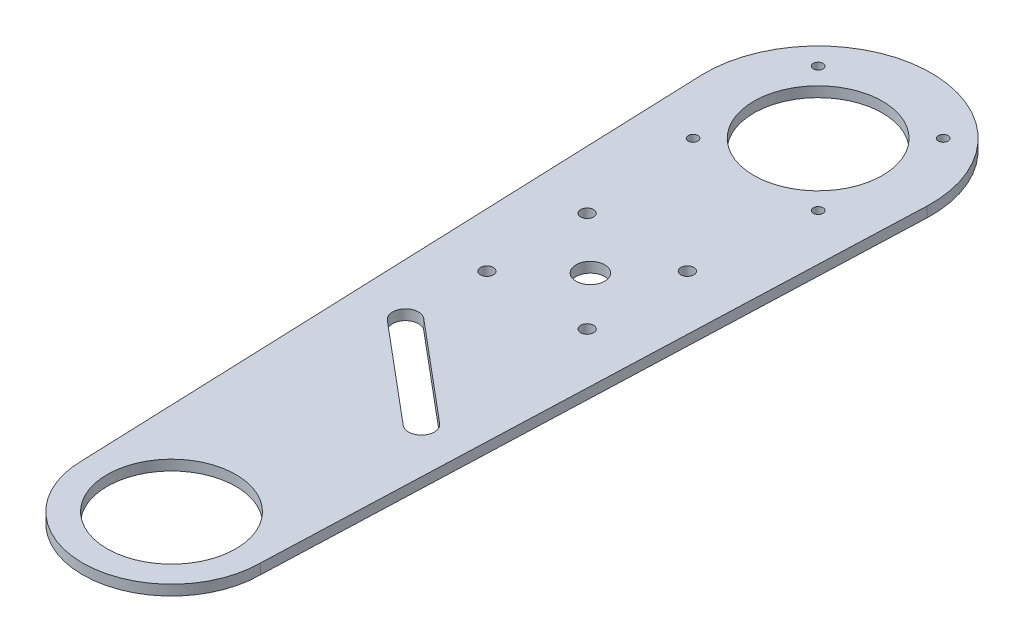
ISO-10303-21;
HEADER;
FILE_DESCRIPTION(('STEP AP214'),'2;1');
FILE_NAME('part.step','',(''),(''),'','','');
FILE_SCHEMA(('AUTOMOTIVE_DESIGN { 1 0 10303 214 1 1 1 1 }'));
ENDSEC;
DATA;
#1=APPLICATION_CONTEXT('core data for automotive mechanical design processes');
#2=APPLICATION_PROTOCOL_DEFINITION('international standard','automotive_design',2000,#1);
#3=PRODUCT_CONTEXT('',#1,'mechanical');
#4=PRODUCT('Part','Part','',(#3));
#5=PRODUCT_RELATED_PRODUCT_CATEGORY('part','',(#4));
#6=PRODUCT_DEFINITION_FORMATION('','',#4);
#7=PRODUCT_DEFINITION_CONTEXT('part definition',#1,'design');
#8=PRODUCT_DEFINITION('design','',#6,#7);
#9=PRODUCT_DEFINITION_SHAPE('','',#8);
#10=(LENGTH_UNIT() NAMED_UNIT(*) SI_UNIT(.MILLI.,.METRE.));
#11=(NAMED_UNIT(*) PLANE_ANGLE_UNIT() SI_UNIT($,.RADIAN.));
#12=(NAMED_UNIT(*) SI_UNIT($,.STERADIAN.) SOLID_ANGLE_UNIT());
#13=UNCERTAINTY_MEASURE_WITH_UNIT(LENGTH_MEASURE(1.E-05),#10,'distance_accuracy_value','');
#14=(GEOMETRIC_REPRESENTATION_CONTEXT(3) GLOBAL_UNCERTAINTY_ASSIGNED_CONTEXT((#13)) GLOBAL_UNIT_ASSIGNED_CONTEXT((#10,
#11,#12)) REPRESENTATION_CONTEXT('',''));
#15=CARTESIAN_POINT('',(0.,0.,0.));
#16=DIRECTION('',(0.,0.,1.));
#17=DIRECTION('',(1.,0.,0.));
#18=AXIS2_PLACEMENT_3D('',#15,#16,#17);
#19=CARTESIAN_POINT('',(31.2181907364059,3.175,1.17454749419578));
#20=DIRECTION('',(-0.999292974733131,0.,-0.0375972159741945));
#21=DIRECTION('',(-0.0375972159741945,0.,0.999292974733131));
#22=AXIS2_PLACEMENT_3D('',#19,#20,#21);
#23=PLANE('',#22);
#24=DIRECTION('',(0.0375972159741945,0.,-0.999292974733131));
#25=VECTOR('',#24,1.);
#26=CARTESIAN_POINT('',(31.2181907364059,0.,1.17454749419578));
#27=LINE('',#26,#25);
#28=CARTESIAN_POINT('',(27.5,0.,100.));
#29=VERTEX_POINT('',#28);
#30=CARTESIAN_POINT('',(34.9752541156596,0.,-98.6840974409032));
#31=VERTEX_POINT('',#30);
#32=EDGE_CURVE('E173',#29,#31,#27,.T.);
#33=ORIENTED_EDGE('',*,*,#32,.T.);
#34=DIRECTION('',(0.,-1.,0.));
#35=VECTOR('',#34,1.);
#36=CARTESIAN_POINT('',(34.9752541156596,3.175,-98.6840974409032));
#37=LINE('',#36,#35);
#38=CARTESIAN_POINT('',(34.9752541156596,3.175,-98.6840974409032));
#39=VERTEX_POINT('',#38);
#40=EDGE_CURVE('E11',#39,#31,#37,.T.);
#41=ORIENTED_EDGE('',*,*,#40,.F.);
#42=DIRECTION('',(0.0375972159741945,0.,-0.999292974733131));
#43=VECTOR('',#42,1.);
#44=CARTESIAN_POINT('',(31.2181907364059,3.175,1.17454749419578));
#45=LINE('',#44,#43);
#46=CARTESIAN_POINT('',(27.5,3.175,100.));
#47=VERTEX_POINT('',#46);
#48=EDGE_CURVE('E182',#47,#39,#45,.T.);
#49=ORIENTED_EDGE('',*,*,#48,.F.);
#50=DIRECTION('',(0.,-1.,0.));
#51=VECTOR('',#50,1.);
#52=CARTESIAN_POINT('',(27.5,3.175,100.));
#53=LINE('',#52,#51);
#54=EDGE_CURVE('E193',#47,#29,#53,.T.);
#55=ORIENTED_EDGE('',*,*,#54,.T.);
#56=EDGE_LOOP('',(#33,#41,#49,#55));
#57=FACE_BOUND('',#56,.T.);
#58=ADVANCED_FACE('F35',(#57),#23,.F.);
#59=CARTESIAN_POINT('',(0.,3.175,-100.));
#60=DIRECTION('',(0.,-1.,0.));
#61=DIRECTION('',(0.,0.,-1.));
#62=AXIS2_PLACEMENT_3D('',#59,#60,#61);
#63=CYLINDRICAL_SURFACE('',#62,35.);
#64=CARTESIAN_POINT('',(0.,0.,-100.));
#65=DIRECTION('',(0.,1.,0.));
#66=DIRECTION('',(0.,0.,1.));
#67=AXIS2_PLACEMENT_3D('',#64,#65,#66);
#68=CIRCLE('',#67,35.);
#69=CARTESIAN_POINT('',(-34.9752541156596,0.,-98.6840974409032));
#70=VERTEX_POINT('',#69);
#71=EDGE_CURVE('E196',#31,#70,#68,.T.);
#72=ORIENTED_EDGE('',*,*,#71,.T.);
#73=DIRECTION('',(0.,-1.,0.));
#74=VECTOR('',#73,1.);
#75=CARTESIAN_POINT('',(-34.9752541156596,3.175,-98.6840974409032));
#76=LINE('',#75,#74);
#77=CARTESIAN_POINT('',(-34.9752541156596,3.175,-98.6840974409032));
#78=VERTEX_POINT('',#77);
#79=EDGE_CURVE('E42',#78,#70,#76,.T.);
#80=ORIENTED_EDGE('',*,*,#79,.F.);
#81=CARTESIAN_POINT('',(0.,3.175,-100.));
#82=DIRECTION('',(0.,1.,0.));
#83=DIRECTION('',(0.,0.,1.));
#84=AXIS2_PLACEMENT_3D('',#81,#82,#83);
#85=CIRCLE('',#84,35.);
#86=EDGE_CURVE('E185',#39,#78,#85,.T.);
#87=ORIENTED_EDGE('',*,*,#86,.F.);
#88=ORIENTED_EDGE('',*,*,#40,.T.);
#89=EDGE_LOOP('',(#72,#80,#87,#88));
#90=FACE_BOUND('',#89,.T.);
#91=ADVANCED_FACE('F212',(#90),#63,.T.);
#92=CARTESIAN_POINT('',(-31.2181907364059,3.175,1.17454749419578));
#93=DIRECTION('',(-0.999292974733131,0.,0.0375972159741945));
#94=DIRECTION('',(0.0375972159741945,0.,0.999292974733131));
#95=AXIS2_PLACEMENT_3D('',#92,#93,#94);
#96=PLANE('',#95);
#97=DIRECTION('',(-0.0375972159741945,0.,-0.999292974733131));
#98=VECTOR('',#97,1.);
#99=CARTESIAN_POINT('',(-31.2181907364059,0.,1.17454749419578));
#100=LINE('',#99,#98);
#101=CARTESIAN_POINT('',(-27.5,0.,100.));
#102=VERTEX_POINT('',#101);
#103=EDGE_CURVE('E199',#102,#70,#100,.T.);
#104=ORIENTED_EDGE('',*,*,#103,.F.);
#105=DIRECTION('',(0.,-1.,0.));
#106=VECTOR('',#105,1.);
#107=CARTESIAN_POINT('',(-27.5,3.175,100.));
#108=LINE('',#107,#106);
#109=CARTESIAN_POINT('',(-27.5,3.175,100.));
#110=VERTEX_POINT('',#109);
#111=EDGE_CURVE('E205',#110,#102,#108,.T.);
#112=ORIENTED_EDGE('',*,*,#111,.F.);
#113=DIRECTION('',(-0.0375972159741945,0.,-0.999292974733131));
#114=VECTOR('',#113,1.);
#115=CARTESIAN_POINT('',(-31.2181907364059,3.175,1.17454749419578));
#116=LINE('',#115,#114);
#117=EDGE_CURVE('E188',#110,#78,#116,.T.);
#118=ORIENTED_EDGE('',*,*,#117,.T.);
#119=ORIENTED_EDGE('',*,*,#79,.T.);
#120=EDGE_LOOP('',(#104,#112,#118,#119));
#121=FACE_BOUND('',#120,.T.);
#122=ADVANCED_FACE('F209',(#121),#96,.T.);
#123=CARTESIAN_POINT('',(0.,3.175,100.));
#124=DIRECTION('',(0.,-1.,0.));
#125=DIRECTION('',(0.,0.,-1.));
#126=AXIS2_PLACEMENT_3D('',#123,#124,#125);
#127=CYLINDRICAL_SURFACE('',#126,27.5);
#128=CARTESIAN_POINT('',(0.,0.,100.));
#129=DIRECTION('',(0.,1.,0.));
#130=DIRECTION('',(0.,0.,1.));
#131=AXIS2_PLACEMENT_3D('',#128,#129,#130);
#132=CIRCLE('',#131,27.5);
#133=EDGE_CURVE('E186',#102,#29,#132,.T.);
#134=ORIENTED_EDGE('',*,*,#133,.T.);
#135=ORIENTED_EDGE('',*,*,#54,.F.);
#136=CARTESIAN_POINT('',(0.,3.175,100.));
#137=DIRECTION('',(0.,1.,0.));
#138=DIRECTION('',(0.,0.,1.));
#139=AXIS2_PLACEMENT_3D('',#136,#137,#138);
#140=CIRCLE('',#139,27.5);
#141=EDGE_CURVE('E191',#110,#47,#140,.T.);
#142=ORIENTED_EDGE('',*,*,#141,.F.);
#143=ORIENTED_EDGE('',*,*,#111,.T.);
#144=EDGE_LOOP('',(#134,#135,#142,#143));
#145=FACE_BOUND('',#144,.T.);
#146=ADVANCED_FACE('F219',(#145),#127,.T.);
#147=CARTESIAN_POINT('',(0.,3.175,0.));
#148=DIRECTION('',(0.,1.,0.));
#149=DIRECTION('',(0.,0.,1.));
#150=AXIS2_PLACEMENT_3D('',#147,#148,#149);
#151=PLANE('',#150);
#152=CARTESIAN_POINT('',(-15.6499999999993,3.175,-13.1999999999996));
#153=DIRECTION('',(0.,-1.,0.));
#154=DIRECTION('',(0.,0.,-1.));
#155=AXIS2_PLACEMENT_3D('',#152,#153,#154);
#156=CIRCLE('',#155,2.);
#157=CARTESIAN_POINT('',(-15.6499999999993,3.175,-15.1999999999996));
#158=VERTEX_POINT('',#157);
#159=EDGE_CURVE('E412',#158,#158,#156,.T.);
#160=ORIENTED_EDGE('',*,*,#159,.T.);
#161=EDGE_LOOP('',(#160));
#162=FACE_BOUND('',#161,.T.);
#163=CARTESIAN_POINT('',(-15.6499999999993,3.175,-44.1999999999996));
#164=DIRECTION('',(0.,-1.,0.));
#165=DIRECTION('',(0.,0.,-1.));
#166=AXIS2_PLACEMENT_3D('',#163,#164,#165);
#167=CIRCLE('',#166,2.);
#168=CARTESIAN_POINT('',(-15.6499999999993,3.175,-46.1999999999996));
#169=VERTEX_POINT('',#168);
#170=EDGE_CURVE('E433',#169,#169,#167,.T.);
#171=ORIENTED_EDGE('',*,*,#170,.T.);
#172=EDGE_LOOP('',(#171));
#173=FACE_BOUND('',#172,.T.);
#174=CARTESIAN_POINT('',(15.3500000000007,3.175,-44.1999999999996));
#175=DIRECTION('',(0.,-1.,0.));
#176=DIRECTION('',(0.,0.,-1.));
#177=AXIS2_PLACEMENT_3D('',#174,#175,#176);
#178=CIRCLE('',#177,2.);
#179=CARTESIAN_POINT('',(15.3500000000007,3.175,-46.1999999999996));
#180=VERTEX_POINT('',#179);
#181=EDGE_CURVE('E424',#180,#180,#178,.T.);
#182=ORIENTED_EDGE('',*,*,#181,.T.);
#183=EDGE_LOOP('',(#182));
#184=FACE_BOUND('',#183,.T.);
#185=CARTESIAN_POINT('',(15.3500000000007,3.175,-13.1999999999996));
#186=DIRECTION('',(0.,-1.,0.));
#187=DIRECTION('',(0.,0.,-1.));
#188=AXIS2_PLACEMENT_3D('',#185,#186,#187);
#189=CIRCLE('',#188,2.);
#190=CARTESIAN_POINT('',(15.3500000000007,3.175,-15.1999999999996));
#191=VERTEX_POINT('',#190);
#192=EDGE_CURVE('E130',#191,#191,#189,.T.);
#193=ORIENTED_EDGE('',*,*,#192,.T.);
#194=EDGE_LOOP('',(#193));
#195=FACE_BOUND('',#194,.T.);
#196=CARTESIAN_POINT('',(15.3208888623802,3.175,38.011504387462));
#197=DIRECTION('',(0.,1.,0.));
#198=DIRECTION('',(0.,0.,-1.));
#199=AXIS2_PLACEMENT_3D('',#196,#197,#198);
#200=CIRCLE('',#199,3.99999999999999);
#201=CARTESIAN_POINT('',(12.749738423634,3.175,41.0756821599379));
#202=VERTEX_POINT('',#201);
#203=CARTESIAN_POINT('',(17.8920393011263,3.175,34.947326614986));
#204=VERTEX_POINT('',#203);
#205=EDGE_CURVE('E49',#202,#204,#200,.T.);
#206=ORIENTED_EDGE('',*,*,#205,.F.);
#207=DIRECTION('',(0.766044443118977,0.,0.642787609686541));
#208=VECTOR('',#207,1.);
#209=CARTESIAN_POINT('',(12.749738423634,3.175,41.0756821599379));
#210=LINE('',#209,#208);
#211=CARTESIAN_POINT('',(-17.892039301125,3.175,15.3641777724762));
#212=VERTEX_POINT('',#211);
#213=EDGE_CURVE('E117',#212,#202,#210,.T.);
#214=ORIENTED_EDGE('',*,*,#213,.F.);
#215=CARTESIAN_POINT('',(-15.3208888623789,3.175,12.3000000000003));
#216=DIRECTION('',(0.,1.,0.));
#217=DIRECTION('',(0.,0.,-1.));
#218=AXIS2_PLACEMENT_3D('',#215,#216,#217);
#219=CIRCLE('',#218,3.99999999999999);
#220=CARTESIAN_POINT('',(-12.7497384236327,3.175,9.23582222752443));
#221=VERTEX_POINT('',#220);
#222=EDGE_CURVE('E120',#221,#212,#219,.T.);
#223=ORIENTED_EDGE('',*,*,#222,.F.);
#224=DIRECTION('',(-0.766044443118977,0.,-0.642787609686541));
#225=VECTOR('',#224,1.);
#226=CARTESIAN_POINT('',(-12.7497384236327,3.175,9.23582222752443));
#227=LINE('',#226,#225);
#228=EDGE_CURVE('E129',#204,#221,#227,.T.);
#229=ORIENTED_EDGE('',*,*,#228,.F.);
#230=EDGE_LOOP('',(#206,#214,#223,#229));
#231=FACE_BOUND('',#230,.T.);
#232=CARTESIAN_POINT('',(0.850000000000642,3.175,-28.6999999999996));
#233=DIRECTION('',(0.,1.,0.));
#234=DIRECTION('',(0.,0.,1.));
#235=AXIS2_PLACEMENT_3D('',#232,#233,#234);
#236=CIRCLE('',#235,4.42499999999999);
#237=CARTESIAN_POINT('',(0.850000000000642,3.175,-24.2749999999996));
#238=VERTEX_POINT('',#237);
#239=EDGE_CURVE('E136',#238,#238,#236,.T.);
#240=ORIENTED_EDGE('',*,*,#239,.F.);
#241=EDGE_LOOP('',(#240));
#242=FACE_BOUND('',#241,.T.);
#243=CARTESIAN_POINT('',(-19.3393704654521,3.175,-80.6606295345479));
#244=DIRECTION('',(0.,1.,0.));
#245=DIRECTION('',(0.,0.,1.));
#246=AXIS2_PLACEMENT_3D('',#243,#244,#245);
#247=CIRCLE('',#246,1.5);
#248=CARTESIAN_POINT('',(-19.3393704654521,3.175,-79.1606295345479));
#249=VERTEX_POINT('',#248);
#250=EDGE_CURVE('E143',#249,#249,#247,.T.);
#251=ORIENTED_EDGE('',*,*,#250,.F.);
#252=EDGE_LOOP('',(#251));
#253=FACE_BOUND('',#252,.T.);
#254=CARTESIAN_POINT('',(-19.3393704654521,3.175,-119.339370465452));
#255=DIRECTION('',(0.,1.,0.));
#256=DIRECTION('',(0.,0.,1.));
#257=AXIS2_PLACEMENT_3D('',#254,#255,#256);
#258=CIRCLE('',#257,1.5);
#259=CARTESIAN_POINT('',(-19.3393704654521,3.175,-117.839370465452));
#260=VERTEX_POINT('',#259);
#261=EDGE_CURVE('E156',#260,#260,#258,.T.);
#262=ORIENTED_EDGE('',*,*,#261,.F.);
#263=EDGE_LOOP('',(#262));
#264=FACE_BOUND('',#263,.T.);
#265=CARTESIAN_POINT('',(19.3393704654521,3.175,-119.339370465452));
#266=DIRECTION('',(0.,1.,0.));
#267=DIRECTION('',(0.,0.,1.));
#268=AXIS2_PLACEMENT_3D('',#265,#266,#267);
#269=CIRCLE('',#268,1.5);
#270=CARTESIAN_POINT('',(19.3393704654521,3.175,-117.839370465452));
#271=VERTEX_POINT('',#270);
#272=EDGE_CURVE('E150',#271,#271,#269,.T.);
#273=ORIENTED_EDGE('',*,*,#272,.F.);
#274=EDGE_LOOP('',(#273));
#275=FACE_BOUND('',#274,.T.);
#276=CARTESIAN_POINT('',(19.3393704654521,3.175,-80.6606295345479));
#277=DIRECTION('',(0.,1.,0.));
#278=DIRECTION('',(0.,0.,1.));
#279=AXIS2_PLACEMENT_3D('',#276,#277,#278);
#280=CIRCLE('',#279,1.5);
#281=CARTESIAN_POINT('',(19.3393704654521,3.175,-79.1606295345479));
#282=VERTEX_POINT('',#281);
#283=EDGE_CURVE('E149',#282,#282,#280,.T.);
#284=ORIENTED_EDGE('',*,*,#283,.F.);
#285=EDGE_LOOP('',(#284));
#286=FACE_BOUND('',#285,.T.);
#287=CARTESIAN_POINT('',(0.,3.175,100.));
#288=DIRECTION('',(0.,1.,0.));
#289=DIRECTION('',(0.,0.,1.));
#290=AXIS2_PLACEMENT_3D('',#287,#288,#289);
#291=CIRCLE('',#290,19.9);
#292=CARTESIAN_POINT('',(0.,3.175,119.9));
#293=VERTEX_POINT('',#292);
#294=EDGE_CURVE('E174',#293,#293,#291,.T.);
#295=ORIENTED_EDGE('',*,*,#294,.F.);
#296=EDGE_LOOP('',(#295));
#297=FACE_BOUND('',#296,.T.);
#298=CARTESIAN_POINT('',(0.,3.175,-100.));
#299=DIRECTION('',(0.,1.,0.));
#300=DIRECTION('',(0.,0.,1.));
#301=AXIS2_PLACEMENT_3D('',#298,#299,#300);
#302=CIRCLE('',#301,19.9);
#303=CARTESIAN_POINT('',(0.,3.175,-80.1));
#304=VERTEX_POINT('',#303);
#305=EDGE_CURVE('E167',#304,#304,#302,.T.);
#306=ORIENTED_EDGE('',*,*,#305,.F.);
#307=EDGE_LOOP('',(#306));
#308=FACE_BOUND('',#307,.T.);
#309=ORIENTED_EDGE('',*,*,#48,.T.);
#310=ORIENTED_EDGE('',*,*,#86,.T.);
#311=ORIENTED_EDGE('',*,*,#117,.F.);
#312=ORIENTED_EDGE('',*,*,#141,.T.);
#313=EDGE_LOOP('',(#309,#310,#311,#312));
#314=FACE_BOUND('',#313,.T.);
#315=ADVANCED_FACE('F224',(#162,#173,#184,#195,#231,#242,#253,#264,#275,#286,#297,#308,#314),
#151,.T.);
#316=CARTESIAN_POINT('',(0.,0.,0.));
#317=DIRECTION('',(0.,1.,0.));
#318=DIRECTION('',(0.,0.,1.));
#319=AXIS2_PLACEMENT_3D('',#316,#317,#318);
#320=PLANE('',#319);
#321=CARTESIAN_POINT('',(-15.6499999999993,0.,-13.1999999999996));
#322=DIRECTION('',(0.,-1.,0.));
#323=DIRECTION('',(0.,0.,-1.));
#324=AXIS2_PLACEMENT_3D('',#321,#322,#323);
#325=CIRCLE('',#324,2.);
#326=CARTESIAN_POINT('',(-15.6499999999993,0.,-15.1999999999996));
#327=VERTEX_POINT('',#326);
#328=EDGE_CURVE('E415',#327,#327,#325,.T.);
#329=ORIENTED_EDGE('',*,*,#328,.F.);
#330=EDGE_LOOP('',(#329));
#331=FACE_BOUND('',#330,.T.);
#332=CARTESIAN_POINT('',(-15.6499999999993,0.,-44.1999999999996));
#333=DIRECTION('',(0.,-1.,0.));
#334=DIRECTION('',(0.,0.,-1.));
#335=AXIS2_PLACEMENT_3D('',#332,#333,#334);
#336=CIRCLE('',#335,2.);
#337=CARTESIAN_POINT('',(-15.6499999999993,0.,-46.1999999999996));
#338=VERTEX_POINT('',#337);
#339=EDGE_CURVE('E417',#338,#338,#336,.T.);
#340=ORIENTED_EDGE('',*,*,#339,.F.);
#341=EDGE_LOOP('',(#340));
#342=FACE_BOUND('',#341,.T.);
#343=CARTESIAN_POINT('',(15.3500000000007,0.,-44.1999999999996));
#344=DIRECTION('',(0.,-1.,0.));
#345=DIRECTION('',(0.,0.,-1.));
#346=AXIS2_PLACEMENT_3D('',#343,#344,#345);
#347=CIRCLE('',#346,2.);
#348=CARTESIAN_POINT('',(15.3500000000007,0.,-46.1999999999996));
#349=VERTEX_POINT('',#348);
#350=EDGE_CURVE('E428',#349,#349,#347,.T.);
#351=ORIENTED_EDGE('',*,*,#350,.F.);
#352=EDGE_LOOP('',(#351));
#353=FACE_BOUND('',#352,.T.);
#354=CARTESIAN_POINT('',(15.3500000000007,0.,-13.1999999999996));
#355=DIRECTION('',(0.,-1.,0.));
#356=DIRECTION('',(0.,0.,-1.));
#357=AXIS2_PLACEMENT_3D('',#354,#355,#356);
#358=CIRCLE('',#357,2.);
#359=CARTESIAN_POINT('',(15.3500000000007,0.,-15.1999999999996));
#360=VERTEX_POINT('',#359);
#361=EDGE_CURVE('E123',#360,#360,#358,.T.);
#362=ORIENTED_EDGE('',*,*,#361,.F.);
#363=EDGE_LOOP('',(#362));
#364=FACE_BOUND('',#363,.T.);
#365=DIRECTION('',(0.766044443118977,0.,0.642787609686541));
#366=VECTOR('',#365,1.);
#367=CARTESIAN_POINT('',(12.749738423634,0.,41.0756821599379));
#368=LINE('',#367,#366);
#369=CARTESIAN_POINT('',(-17.892039301125,0.,15.3641777724762));
#370=VERTEX_POINT('',#369);
#371=CARTESIAN_POINT('',(12.749738423634,0.,41.0756821599379));
#372=VERTEX_POINT('',#371);
#373=EDGE_CURVE('E107',#370,#372,#368,.T.);
#374=ORIENTED_EDGE('',*,*,#373,.T.);
#375=CARTESIAN_POINT('',(15.3208888623802,0.,38.011504387462));
#376=DIRECTION('',(0.,1.,0.));
#377=DIRECTION('',(0.,0.,-1.));
#378=AXIS2_PLACEMENT_3D('',#375,#376,#377);
#379=CIRCLE('',#378,3.99999999999999);
#380=CARTESIAN_POINT('',(17.8920393011263,0.,34.947326614986));
#381=VERTEX_POINT('',#380);
#382=EDGE_CURVE('E101',#372,#381,#379,.T.);
#383=ORIENTED_EDGE('',*,*,#382,.T.);
#384=DIRECTION('',(-0.766044443118977,0.,-0.642787609686541));
#385=VECTOR('',#384,1.);
#386=CARTESIAN_POINT('',(-12.7497384236327,0.,9.23582222752443));
#387=LINE('',#386,#385);
#388=CARTESIAN_POINT('',(-12.7497384236327,0.,9.23582222752443));
#389=VERTEX_POINT('',#388);
#390=EDGE_CURVE('E110',#381,#389,#387,.T.);
#391=ORIENTED_EDGE('',*,*,#390,.T.);
#392=CARTESIAN_POINT('',(-15.3208888623789,0.,12.3000000000003));
#393=DIRECTION('',(0.,1.,0.));
#394=DIRECTION('',(0.,0.,-1.));
#395=AXIS2_PLACEMENT_3D('',#392,#393,#394);
#396=CIRCLE('',#395,3.99999999999999);
#397=EDGE_CURVE('E57',#389,#370,#396,.T.);
#398=ORIENTED_EDGE('',*,*,#397,.T.);
#399=EDGE_LOOP('',(#374,#383,#391,#398));
#400=FACE_BOUND('',#399,.T.);
#401=CARTESIAN_POINT('',(0.850000000000642,0.,-28.6999999999996));
#402=DIRECTION('',(0.,1.,0.));
#403=DIRECTION('',(0.,0.,1.));
#404=AXIS2_PLACEMENT_3D('',#401,#402,#403);
#405=CIRCLE('',#404,4.42499999999999);
#406=CARTESIAN_POINT('',(0.850000000000642,0.,-24.2749999999996));
#407=VERTEX_POINT('',#406);
#408=EDGE_CURVE('E140',#407,#407,#405,.T.);
#409=ORIENTED_EDGE('',*,*,#408,.T.);
#410=EDGE_LOOP('',(#409));
#411=FACE_BOUND('',#410,.T.);
#412=CARTESIAN_POINT('',(-19.3393704654521,0.,-80.6606295345479));
#413=DIRECTION('',(0.,1.,0.));
#414=DIRECTION('',(0.,0.,1.));
#415=AXIS2_PLACEMENT_3D('',#412,#413,#414);
#416=CIRCLE('',#415,1.5);
#417=CARTESIAN_POINT('',(-19.3393704654521,0.,-79.1606295345479));
#418=VERTEX_POINT('',#417);
#419=EDGE_CURVE('E159',#418,#418,#416,.T.);
#420=ORIENTED_EDGE('',*,*,#419,.T.);
#421=EDGE_LOOP('',(#420));
#422=FACE_BOUND('',#421,.T.);
#423=CARTESIAN_POINT('',(-19.3393704654521,0.,-119.339370465452));
#424=DIRECTION('',(0.,1.,0.));
#425=DIRECTION('',(0.,0.,1.));
#426=AXIS2_PLACEMENT_3D('',#423,#424,#425);
#427=CIRCLE('',#426,1.5);
#428=CARTESIAN_POINT('',(-19.3393704654521,0.,-117.839370465452));
#429=VERTEX_POINT('',#428);
#430=EDGE_CURVE('E153',#429,#429,#427,.T.);
#431=ORIENTED_EDGE('',*,*,#430,.T.);
#432=EDGE_LOOP('',(#431));
#433=FACE_BOUND('',#432,.T.);
#434=CARTESIAN_POINT('',(19.3393704654521,0.,-119.339370465452));
#435=DIRECTION('',(0.,1.,0.));
#436=DIRECTION('',(0.,0.,1.));
#437=AXIS2_PLACEMENT_3D('',#434,#435,#436);
#438=CIRCLE('',#437,1.5);
#439=CARTESIAN_POINT('',(19.3393704654521,0.,-117.839370465452));
#440=VERTEX_POINT('',#439);
#441=EDGE_CURVE('E146',#440,#440,#438,.T.);
#442=ORIENTED_EDGE('',*,*,#441,.T.);
#443=EDGE_LOOP('',(#442));
#444=FACE_BOUND('',#443,.T.);
#445=CARTESIAN_POINT('',(19.3393704654521,0.,-80.6606295345479));
#446=DIRECTION('',(0.,1.,0.));
#447=DIRECTION('',(0.,0.,1.));
#448=AXIS2_PLACEMENT_3D('',#445,#446,#447);
#449=CIRCLE('',#448,1.5);
#450=CARTESIAN_POINT('',(19.3393704654521,0.,-79.1606295345479));
#451=VERTEX_POINT('',#450);
#452=EDGE_CURVE('E164',#451,#451,#449,.T.);
#453=ORIENTED_EDGE('',*,*,#452,.T.);
#454=EDGE_LOOP('',(#453));
#455=FACE_BOUND('',#454,.T.);
#456=CARTESIAN_POINT('',(0.,0.,100.));
#457=DIRECTION('',(0.,1.,0.));
#458=DIRECTION('',(0.,0.,1.));
#459=AXIS2_PLACEMENT_3D('',#456,#457,#458);
#460=CIRCLE('',#459,19.9);
#461=CARTESIAN_POINT('',(0.,0.,119.9));
#462=VERTEX_POINT('',#461);
#463=EDGE_CURVE('E170',#462,#462,#460,.T.);
#464=ORIENTED_EDGE('',*,*,#463,.T.);
#465=EDGE_LOOP('',(#464));
#466=FACE_BOUND('',#465,.T.);
#467=CARTESIAN_POINT('',(0.,0.,-100.));
#468=DIRECTION('',(0.,1.,0.));
#469=DIRECTION('',(0.,0.,1.));
#470=AXIS2_PLACEMENT_3D('',#467,#468,#469);
#471=CIRCLE('',#470,19.9);
#472=CARTESIAN_POINT('',(0.,0.,-80.1));
#473=VERTEX_POINT('',#472);
#474=EDGE_CURVE('E177',#473,#473,#471,.T.);
#475=ORIENTED_EDGE('',*,*,#474,.T.);
#476=EDGE_LOOP('',(#475));
#477=FACE_BOUND('',#476,.T.);
#478=ORIENTED_EDGE('',*,*,#32,.F.);
#479=ORIENTED_EDGE('',*,*,#133,.F.);
#480=ORIENTED_EDGE('',*,*,#103,.T.);
#481=ORIENTED_EDGE('',*,*,#71,.F.);
#482=EDGE_LOOP('',(#478,#479,#480,#481));
#483=FACE_BOUND('',#482,.T.);
#484=ADVANCED_FACE('F114',(#331,#342,#353,#364,#400,#411,#422,#433,#444,#455,#466,#477,#483),
#320,.F.);
#485=CARTESIAN_POINT('',(0.,0.,-100.));
#486=DIRECTION('',(0.,1.,0.));
#487=DIRECTION('',(0.,0.,1.));
#488=AXIS2_PLACEMENT_3D('',#485,#486,#487);
#489=CYLINDRICAL_SURFACE('',#488,19.9);
#490=ORIENTED_EDGE('',*,*,#474,.F.);
#491=EDGE_LOOP('',(#490));
#492=FACE_BOUND('',#491,.T.);
#493=ORIENTED_EDGE('',*,*,#305,.T.);
#494=EDGE_LOOP('',(#493));
#495=FACE_BOUND('',#494,.T.);
#496=ADVANCED_FACE('F232',(#492,#495),#489,.F.);
#497=CARTESIAN_POINT('',(0.,0.,100.));
#498=DIRECTION('',(0.,1.,0.));
#499=DIRECTION('',(0.,0.,1.));
#500=AXIS2_PLACEMENT_3D('',#497,#498,#499);
#501=CYLINDRICAL_SURFACE('',#500,19.9);
#502=ORIENTED_EDGE('',*,*,#463,.F.);
#503=EDGE_LOOP('',(#502));
#504=FACE_BOUND('',#503,.T.);
#505=ORIENTED_EDGE('',*,*,#294,.T.);
#506=EDGE_LOOP('',(#505));
#507=FACE_BOUND('',#506,.T.);
#508=ADVANCED_FACE('F263',(#504,#507),#501,.F.);
#509=CARTESIAN_POINT('',(19.3393704654521,0.,-80.6606295345479));
#510=DIRECTION('',(0.,1.,0.));
#511=DIRECTION('',(0.,0.,1.));
#512=AXIS2_PLACEMENT_3D('',#509,#510,#511);
#513=CYLINDRICAL_SURFACE('',#512,1.5);
#514=ORIENTED_EDGE('',*,*,#452,.F.);
#515=EDGE_LOOP('',(#514));
#516=FACE_BOUND('',#515,.T.);
#517=ORIENTED_EDGE('',*,*,#283,.T.);
#518=EDGE_LOOP('',(#517));
#519=FACE_BOUND('',#518,.T.);
#520=ADVANCED_FACE('F273',(#516,#519),#513,.F.);
#521=CARTESIAN_POINT('',(19.3393704654521,0.,-119.339370465452));
#522=DIRECTION('',(0.,1.,0.));
#523=DIRECTION('',(0.,0.,1.));
#524=AXIS2_PLACEMENT_3D('',#521,#522,#523);
#525=CYLINDRICAL_SURFACE('',#524,1.5);
#526=ORIENTED_EDGE('',*,*,#441,.F.);
#527=EDGE_LOOP('',(#526));
#528=FACE_BOUND('',#527,.T.);
#529=ORIENTED_EDGE('',*,*,#272,.T.);
#530=EDGE_LOOP('',(#529));
#531=FACE_BOUND('',#530,.T.);
#532=ADVANCED_FACE('F283',(#528,#531),#525,.F.);
#533=CARTESIAN_POINT('',(-19.3393704654521,0.,-119.339370465452));
#534=DIRECTION('',(0.,1.,0.));
#535=DIRECTION('',(0.,0.,1.));
#536=AXIS2_PLACEMENT_3D('',#533,#534,#535);
#537=CYLINDRICAL_SURFACE('',#536,1.5);
#538=ORIENTED_EDGE('',*,*,#430,.F.);
#539=EDGE_LOOP('',(#538));
#540=FACE_BOUND('',#539,.T.);
#541=ORIENTED_EDGE('',*,*,#261,.T.);
#542=EDGE_LOOP('',(#541));
#543=FACE_BOUND('',#542,.T.);
#544=ADVANCED_FACE('F293',(#540,#543),#537,.F.);
#545=CARTESIAN_POINT('',(-19.3393704654521,0.,-80.6606295345479));
#546=DIRECTION('',(0.,1.,0.));
#547=DIRECTION('',(0.,0.,1.));
#548=AXIS2_PLACEMENT_3D('',#545,#546,#547);
#549=CYLINDRICAL_SURFACE('',#548,1.5);
#550=ORIENTED_EDGE('',*,*,#419,.F.);
#551=EDGE_LOOP('',(#550));
#552=FACE_BOUND('',#551,.T.);
#553=ORIENTED_EDGE('',*,*,#250,.T.);
#554=EDGE_LOOP('',(#553));
#555=FACE_BOUND('',#554,.T.);
#556=ADVANCED_FACE('F303',(#552,#555),#549,.F.);
#557=CARTESIAN_POINT('',(0.850000000000642,0.,-28.6999999999996));
#558=DIRECTION('',(0.,1.,0.));
#559=DIRECTION('',(0.,0.,1.));
#560=AXIS2_PLACEMENT_3D('',#557,#558,#559);
#561=CYLINDRICAL_SURFACE('',#560,4.42499999999999);
#562=ORIENTED_EDGE('',*,*,#408,.F.);
#563=EDGE_LOOP('',(#562));
#564=FACE_BOUND('',#563,.T.);
#565=ORIENTED_EDGE('',*,*,#239,.T.);
#566=EDGE_LOOP('',(#565));
#567=FACE_BOUND('',#566,.T.);
#568=ADVANCED_FACE('F313',(#564,#567),#561,.F.);
#569=CARTESIAN_POINT('',(15.3208888623802,0.,38.011504387462));
#570=DIRECTION('',(0.,1.,0.));
#571=DIRECTION('',(0.,0.,1.));
#572=AXIS2_PLACEMENT_3D('',#569,#570,#571);
#573=CYLINDRICAL_SURFACE('',#572,3.99999999999999);
#574=ORIENTED_EDGE('',*,*,#205,.T.);
#575=DIRECTION('',(0.,1.,0.));
#576=VECTOR('',#575,1.);
#577=CARTESIAN_POINT('',(17.8920393011263,0.,34.947326614986));
#578=LINE('',#577,#576);
#579=EDGE_CURVE('E97',#381,#204,#578,.T.);
#580=ORIENTED_EDGE('',*,*,#579,.F.);
#581=ORIENTED_EDGE('',*,*,#382,.F.);
#582=DIRECTION('',(0.,1.,0.));
#583=VECTOR('',#582,1.);
#584=CARTESIAN_POINT('',(12.749738423634,0.,41.0756821599379));
#585=LINE('',#584,#583);
#586=EDGE_CURVE('E134',#372,#202,#585,.T.);
#587=ORIENTED_EDGE('',*,*,#586,.T.);
#588=EDGE_LOOP('',(#574,#580,#581,#587));
#589=FACE_BOUND('',#588,.T.);
#590=ADVANCED_FACE('F99',(#589),#573,.F.);
#591=CARTESIAN_POINT('',(12.749738423634,0.,41.0756821599379));
#592=DIRECTION('',(-0.64278760968654,0.,0.766044443118977));
#593=DIRECTION('',(0.766044443118977,0.,0.642787609686541));
#594=AXIS2_PLACEMENT_3D('',#591,#592,#593);
#595=PLANE('',#594);
#596=ORIENTED_EDGE('',*,*,#213,.T.);
#597=ORIENTED_EDGE('',*,*,#586,.F.);
#598=ORIENTED_EDGE('',*,*,#373,.F.);
#599=DIRECTION('',(0.,1.,0.));
#600=VECTOR('',#599,1.);
#601=CARTESIAN_POINT('',(-17.892039301125,0.,15.3641777724762));
#602=LINE('',#601,#600);
#603=EDGE_CURVE('E137',#370,#212,#602,.T.);
#604=ORIENTED_EDGE('',*,*,#603,.T.);
#605=EDGE_LOOP('',(#596,#597,#598,#604));
#606=FACE_BOUND('',#605,.T.);
#607=ADVANCED_FACE('F332',(#606),#595,.F.);
#608=CARTESIAN_POINT('',(-15.3208888623789,0.,12.3000000000003));
#609=DIRECTION('',(0.,1.,0.));
#610=DIRECTION('',(0.,0.,1.));
#611=AXIS2_PLACEMENT_3D('',#608,#609,#610);
#612=CYLINDRICAL_SURFACE('',#611,3.99999999999999);
#613=ORIENTED_EDGE('',*,*,#222,.T.);
#614=ORIENTED_EDGE('',*,*,#603,.F.);
#615=ORIENTED_EDGE('',*,*,#397,.F.);
#616=DIRECTION('',(0.,1.,0.));
#617=VECTOR('',#616,1.);
#618=CARTESIAN_POINT('',(-12.7497384236327,0.,9.23582222752443));
#619=LINE('',#618,#617);
#620=EDGE_CURVE('E106',#389,#221,#619,.T.);
#621=ORIENTED_EDGE('',*,*,#620,.T.);
#622=EDGE_LOOP('',(#613,#614,#615,#621));
#623=FACE_BOUND('',#622,.T.);
#624=ADVANCED_FACE('F341',(#623),#612,.F.);
#625=CARTESIAN_POINT('',(-12.7497384236327,0.,9.23582222752443));
#626=DIRECTION('',(0.642787609686541,0.,-0.766044443118977));
#627=DIRECTION('',(-0.766044443118977,0.,-0.642787609686541));
#628=AXIS2_PLACEMENT_3D('',#625,#626,#627);
#629=PLANE('',#628);
#630=ORIENTED_EDGE('',*,*,#228,.T.);
#631=ORIENTED_EDGE('',*,*,#620,.F.);
#632=ORIENTED_EDGE('',*,*,#390,.F.);
#633=ORIENTED_EDGE('',*,*,#579,.T.);
#634=EDGE_LOOP('',(#630,#631,#632,#633));
#635=FACE_BOUND('',#634,.T.);
#636=ADVANCED_FACE('F111',(#635),#629,.F.);
#637=CARTESIAN_POINT('',(15.3500000000007,3.175,-13.1999999999996));
#638=DIRECTION('',(0.,-1.,0.));
#639=DIRECTION('',(0.,0.,-1.));
#640=AXIS2_PLACEMENT_3D('',#637,#638,#639);
#641=CYLINDRICAL_SURFACE('',#640,2.);
#642=ORIENTED_EDGE('',*,*,#192,.F.);
#643=EDGE_LOOP('',(#642));
#644=FACE_BOUND('',#643,.T.);
#645=ORIENTED_EDGE('',*,*,#361,.T.);
#646=EDGE_LOOP('',(#645));
#647=FACE_BOUND('',#646,.T.);
#648=ADVANCED_FACE('F358',(#644,#647),#641,.F.);
#649=CARTESIAN_POINT('',(15.3500000000007,3.175,-44.1999999999996));
#650=DIRECTION('',(0.,-1.,0.));
#651=DIRECTION('',(0.,0.,-1.));
#652=AXIS2_PLACEMENT_3D('',#649,#650,#651);
#653=CYLINDRICAL_SURFACE('',#652,2.);
#654=ORIENTED_EDGE('',*,*,#181,.F.);
#655=EDGE_LOOP('',(#654));
#656=FACE_BOUND('',#655,.T.);
#657=ORIENTED_EDGE('',*,*,#350,.T.);
#658=EDGE_LOOP('',(#657));
#659=FACE_BOUND('',#658,.T.);
#660=ADVANCED_FACE('F376',(#656,#659),#653,.F.);
#661=CARTESIAN_POINT('',(-15.6499999999993,3.175,-44.1999999999996));
#662=DIRECTION('',(0.,-1.,0.));
#663=DIRECTION('',(0.,0.,-1.));
#664=AXIS2_PLACEMENT_3D('',#661,#662,#663);
#665=CYLINDRICAL_SURFACE('',#664,2.);
#666=ORIENTED_EDGE('',*,*,#170,.F.);
#667=EDGE_LOOP('',(#666));
#668=FACE_BOUND('',#667,.T.);
#669=ORIENTED_EDGE('',*,*,#339,.T.);
#670=EDGE_LOOP('',(#669));
#671=FACE_BOUND('',#670,.T.);
#672=ADVANCED_FACE('F386',(#668,#671),#665,.F.);
#673=CARTESIAN_POINT('',(-15.6499999999993,3.175,-13.1999999999996));
#674=DIRECTION('',(0.,-1.,0.));
#675=DIRECTION('',(0.,0.,-1.));
#676=AXIS2_PLACEMENT_3D('',#673,#674,#675);
#677=CYLINDRICAL_SURFACE('',#676,2.);
#678=ORIENTED_EDGE('',*,*,#159,.F.);
#679=EDGE_LOOP('',(#678));
#680=FACE_BOUND('',#679,.T.);
#681=ORIENTED_EDGE('',*,*,#328,.T.);
#682=EDGE_LOOP('',(#681));
#683=FACE_BOUND('',#682,.T.);
#684=ADVANCED_FACE('F396',(#680,#683),#677,.F.);
#685=CLOSED_SHELL('',(#58,#91,#122,#146,#315,#484,#496,#508,#520,#532,#544,#556,#568,#590,#607,
#624,#636,#648,#660,#672,#684));
#686=MANIFOLD_SOLID_BREP('B2',#685);
#687=ADVANCED_BREP_SHAPE_REPRESENTATION('',(#18,#686),#14);
#688=SHAPE_DEFINITION_REPRESENTATION(#9,#687);
ENDSEC;
END-ISO-10303-21;
